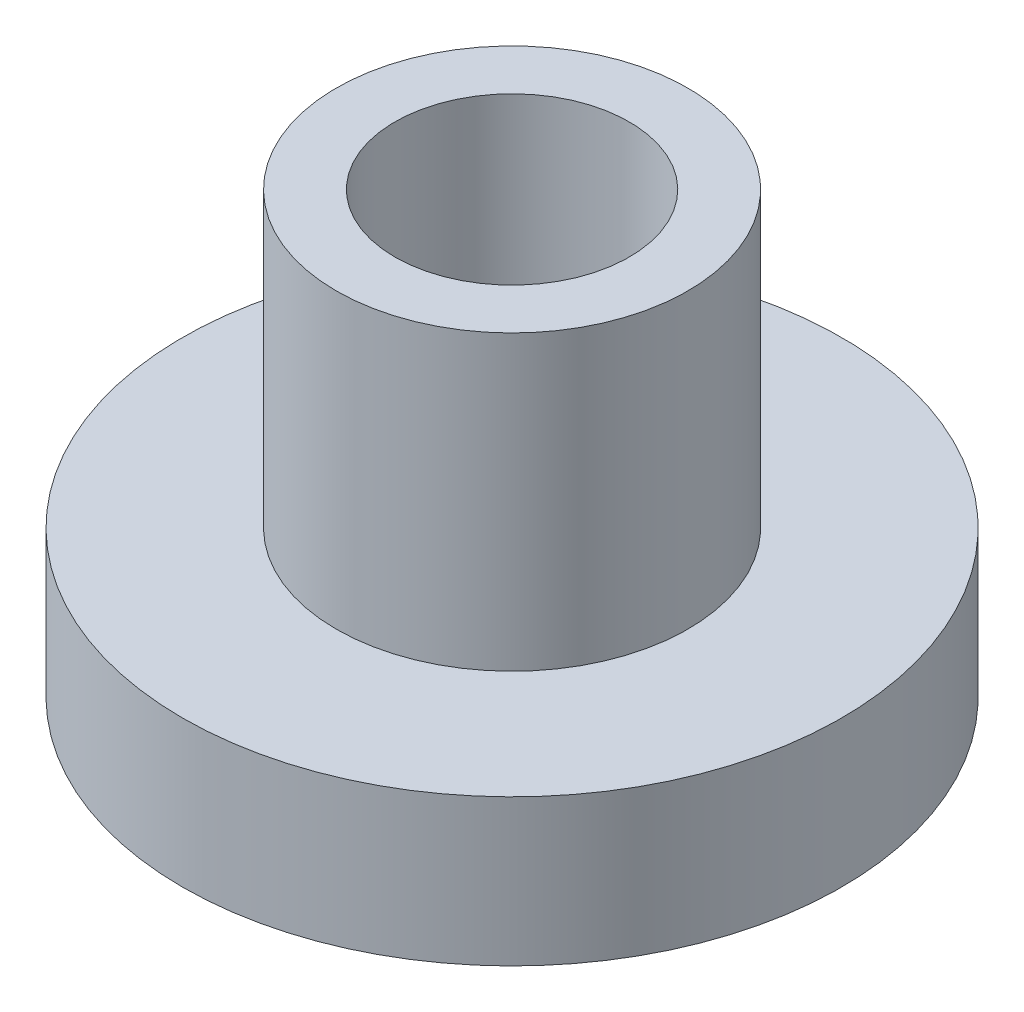
ISO-10303-21;
HEADER;
FILE_DESCRIPTION(('STEP AP214'),'2;1');
FILE_NAME('part.step','',(''),(''),'','','');
FILE_SCHEMA(('AUTOMOTIVE_DESIGN { 1 0 10303 214 1 1 1 1 }'));
ENDSEC;
DATA;
#1=APPLICATION_CONTEXT('core data for automotive mechanical design processes');
#2=APPLICATION_PROTOCOL_DEFINITION('international standard','automotive_design',2000,#1);
#3=PRODUCT_CONTEXT('',#1,'mechanical');
#4=PRODUCT('Part','Part','',(#3));
#5=PRODUCT_RELATED_PRODUCT_CATEGORY('part','',(#4));
#6=PRODUCT_DEFINITION_FORMATION('','',#4);
#7=PRODUCT_DEFINITION_CONTEXT('part definition',#1,'design');
#8=PRODUCT_DEFINITION('design','',#6,#7);
#9=PRODUCT_DEFINITION_SHAPE('','',#8);
#10=(LENGTH_UNIT() NAMED_UNIT(*) SI_UNIT(.MILLI.,.METRE.));
#11=(NAMED_UNIT(*) PLANE_ANGLE_UNIT() SI_UNIT($,.RADIAN.));
#12=(NAMED_UNIT(*) SI_UNIT($,.STERADIAN.) SOLID_ANGLE_UNIT());
#13=UNCERTAINTY_MEASURE_WITH_UNIT(LENGTH_MEASURE(1.E-05),#10,'distance_accuracy_value','');
#14=(GEOMETRIC_REPRESENTATION_CONTEXT(3) GLOBAL_UNCERTAINTY_ASSIGNED_CONTEXT((#13)) GLOBAL_UNIT_ASSIGNED_CONTEXT((#10,
#11,#12)) REPRESENTATION_CONTEXT('',''));
#15=CARTESIAN_POINT('',(0.,0.,0.));
#16=DIRECTION('',(0.,0.,1.));
#17=DIRECTION('',(1.,0.,0.));
#18=AXIS2_PLACEMENT_3D('',#15,#16,#17);
#19=CARTESIAN_POINT('',(0.,0.,4.5));
#20=DIRECTION('',(0.,-1.,0.));
#21=DIRECTION('',(0.,0.,-1.));
#22=AXIS2_PLACEMENT_3D('',#19,#20,#21);
#23=PLANE('',#22);
#24=CARTESIAN_POINT('',(0.,0.,0.));
#25=DIRECTION('',(0.,1.,0.));
#26=DIRECTION('',(0.,0.,1.));
#27=AXIS2_PLACEMENT_3D('',#24,#25,#26);
#28=CIRCLE('',#27,1.6);
#29=CARTESIAN_POINT('',(0.,0.,1.6));
#30=VERTEX_POINT('',#29);
#31=EDGE_CURVE('E10',#30,#30,#28,.T.);
#32=ORIENTED_EDGE('',*,*,#31,.T.);
#33=EDGE_LOOP('',(#32));
#34=FACE_BOUND('',#33,.T.);
#35=CARTESIAN_POINT('',(0.,0.,0.));
#36=DIRECTION('',(0.,1.,0.));
#37=DIRECTION('',(0.,0.,1.));
#38=AXIS2_PLACEMENT_3D('',#35,#36,#37);
#39=CIRCLE('',#38,4.5);
#40=CARTESIAN_POINT('',(0.,0.,4.5));
#41=VERTEX_POINT('',#40);
#42=EDGE_CURVE('E52',#41,#41,#39,.T.);
#43=ORIENTED_EDGE('',*,*,#42,.F.);
#44=EDGE_LOOP('',(#43));
#45=FACE_BOUND('',#44,.T.);
#46=ADVANCED_FACE('F30',(#34,#45),#23,.T.);
#47=CARTESIAN_POINT('',(0.,6.84805820569183,0.));
#48=DIRECTION('',(0.,1.,0.));
#49=DIRECTION('',(0.,0.,1.));
#50=AXIS2_PLACEMENT_3D('',#47,#48,#49);
#51=CYLINDRICAL_SURFACE('',#50,1.6);
#52=CARTESIAN_POINT('',(0.,6.,0.));
#53=DIRECTION('',(0.,1.,0.));
#54=DIRECTION('',(0.,0.,1.));
#55=AXIS2_PLACEMENT_3D('',#52,#53,#54);
#56=CIRCLE('',#55,1.6);
#57=CARTESIAN_POINT('',(0.,6.,1.6));
#58=VERTEX_POINT('',#57);
#59=EDGE_CURVE('E36',#58,#58,#56,.T.);
#60=ORIENTED_EDGE('',*,*,#59,.T.);
#61=EDGE_LOOP('',(#60));
#62=FACE_BOUND('',#61,.T.);
#63=ORIENTED_EDGE('',*,*,#31,.F.);
#64=EDGE_LOOP('',(#63));
#65=FACE_BOUND('',#64,.T.);
#66=ADVANCED_FACE('F60',(#62,#65),#51,.F.);
#67=CARTESIAN_POINT('',(0.,6.,1.6));
#68=DIRECTION('',(0.,1.,0.));
#69=DIRECTION('',(0.,0.,1.));
#70=AXIS2_PLACEMENT_3D('',#67,#68,#69);
#71=PLANE('',#70);
#72=CARTESIAN_POINT('',(0.,6.,0.));
#73=DIRECTION('',(0.,1.,0.));
#74=DIRECTION('',(0.,0.,1.));
#75=AXIS2_PLACEMENT_3D('',#72,#73,#74);
#76=CIRCLE('',#75,2.4);
#77=CARTESIAN_POINT('',(0.,6.,2.4));
#78=VERTEX_POINT('',#77);
#79=EDGE_CURVE('E40',#78,#78,#76,.T.);
#80=ORIENTED_EDGE('',*,*,#79,.T.);
#81=EDGE_LOOP('',(#80));
#82=FACE_BOUND('',#81,.T.);
#83=ORIENTED_EDGE('',*,*,#59,.F.);
#84=EDGE_LOOP('',(#83));
#85=FACE_BOUND('',#84,.T.);
#86=ADVANCED_FACE('F64',(#82,#85),#71,.T.);
#87=CARTESIAN_POINT('',(0.,6.84805820569183,0.));
#88=DIRECTION('',(0.,1.,0.));
#89=DIRECTION('',(0.,0.,1.));
#90=AXIS2_PLACEMENT_3D('',#87,#88,#89);
#91=CYLINDRICAL_SURFACE('',#90,2.4);
#92=CARTESIAN_POINT('',(0.,2.,0.));
#93=DIRECTION('',(0.,1.,0.));
#94=DIRECTION('',(0.,0.,1.));
#95=AXIS2_PLACEMENT_3D('',#92,#93,#94);
#96=CIRCLE('',#95,2.4);
#97=CARTESIAN_POINT('',(0.,2.,2.4));
#98=VERTEX_POINT('',#97);
#99=EDGE_CURVE('E44',#98,#98,#96,.T.);
#100=ORIENTED_EDGE('',*,*,#99,.T.);
#101=EDGE_LOOP('',(#100));
#102=FACE_BOUND('',#101,.T.);
#103=ORIENTED_EDGE('',*,*,#79,.F.);
#104=EDGE_LOOP('',(#103));
#105=FACE_BOUND('',#104,.T.);
#106=ADVANCED_FACE('F68',(#102,#105),#91,.T.);
#107=CARTESIAN_POINT('',(0.,2.,2.4));
#108=DIRECTION('',(0.,1.,0.));
#109=DIRECTION('',(0.,0.,1.));
#110=AXIS2_PLACEMENT_3D('',#107,#108,#109);
#111=PLANE('',#110);
#112=CARTESIAN_POINT('',(0.,2.,0.));
#113=DIRECTION('',(0.,1.,0.));
#114=DIRECTION('',(0.,0.,1.));
#115=AXIS2_PLACEMENT_3D('',#112,#113,#114);
#116=CIRCLE('',#115,4.5);
#117=CARTESIAN_POINT('',(0.,2.,4.5));
#118=VERTEX_POINT('',#117);
#119=EDGE_CURVE('E49',#118,#118,#116,.T.);
#120=ORIENTED_EDGE('',*,*,#119,.T.);
#121=EDGE_LOOP('',(#120));
#122=FACE_BOUND('',#121,.T.);
#123=ORIENTED_EDGE('',*,*,#99,.F.);
#124=EDGE_LOOP('',(#123));
#125=FACE_BOUND('',#124,.T.);
#126=ADVANCED_FACE('F75',(#122,#125),#111,.T.);
#127=CARTESIAN_POINT('',(0.,6.84805820569183,0.));
#128=DIRECTION('',(0.,1.,0.));
#129=DIRECTION('',(0.,0.,1.));
#130=AXIS2_PLACEMENT_3D('',#127,#128,#129);
#131=CYLINDRICAL_SURFACE('',#130,4.5);
#132=ORIENTED_EDGE('',*,*,#42,.T.);
#133=EDGE_LOOP('',(#132));
#134=FACE_BOUND('',#133,.T.);
#135=ORIENTED_EDGE('',*,*,#119,.F.);
#136=EDGE_LOOP('',(#135));
#137=FACE_BOUND('',#136,.T.);
#138=ADVANCED_FACE('F56',(#134,#137),#131,.T.);
#139=CLOSED_SHELL('',(#46,#66,#86,#106,#126,#138));
#140=MANIFOLD_SOLID_BREP('B2',#139);
#141=ADVANCED_BREP_SHAPE_REPRESENTATION('',(#18,#140),#14);
#142=SHAPE_DEFINITION_REPRESENTATION(#9,#141);
ENDSEC;
END-ISO-10303-21;
